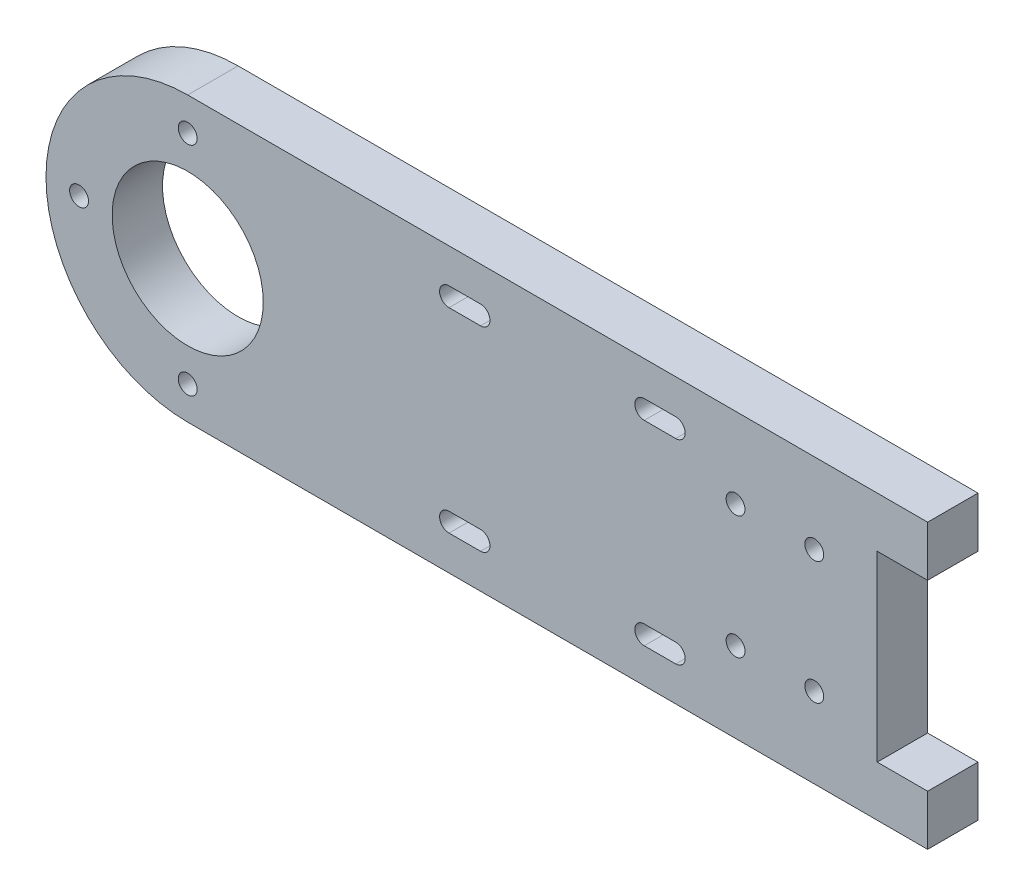
ISO-10303-21;
HEADER;
FILE_DESCRIPTION(('STEP AP214'),'2;1');
FILE_NAME('part.step','',(''),(''),'','','');
FILE_SCHEMA(('AUTOMOTIVE_DESIGN { 1 0 10303 214 1 1 1 1 }'));
ENDSEC;
DATA;
#1=APPLICATION_CONTEXT('core data for automotive mechanical design processes');
#2=APPLICATION_PROTOCOL_DEFINITION('international standard','automotive_design',2000,#1);
#3=PRODUCT_CONTEXT('',#1,'mechanical');
#4=PRODUCT('Part','Part','',(#3));
#5=PRODUCT_RELATED_PRODUCT_CATEGORY('part','',(#4));
#6=PRODUCT_DEFINITION_FORMATION('','',#4);
#7=PRODUCT_DEFINITION_CONTEXT('part definition',#1,'design');
#8=PRODUCT_DEFINITION('design','',#6,#7);
#9=PRODUCT_DEFINITION_SHAPE('','',#8);
#10=(LENGTH_UNIT() NAMED_UNIT(*) SI_UNIT(.MILLI.,.METRE.));
#11=(NAMED_UNIT(*) PLANE_ANGLE_UNIT() SI_UNIT($,.RADIAN.));
#12=(NAMED_UNIT(*) SI_UNIT($,.STERADIAN.) SOLID_ANGLE_UNIT());
#13=UNCERTAINTY_MEASURE_WITH_UNIT(LENGTH_MEASURE(1.E-05),#10,'distance_accuracy_value','');
#14=(GEOMETRIC_REPRESENTATION_CONTEXT(3) GLOBAL_UNCERTAINTY_ASSIGNED_CONTEXT((#13)) GLOBAL_UNIT_ASSIGNED_CONTEXT((#10,
#11,#12)) REPRESENTATION_CONTEXT('',''));
#15=CARTESIAN_POINT('',(0.,0.,0.));
#16=DIRECTION('',(0.,0.,1.));
#17=DIRECTION('',(1.,0.,0.));
#18=AXIS2_PLACEMENT_3D('',#15,#16,#17);
#19=CARTESIAN_POINT('',(0.,8.,8.));
#20=DIRECTION('',(0.,-1.,0.));
#21=DIRECTION('',(0.,0.,-1.));
#22=AXIS2_PLACEMENT_3D('',#19,#20,#21);
#23=PLANE('',#22);
#24=DIRECTION('',(-1.,0.,0.));
#25=VECTOR('',#24,1.);
#26=CARTESIAN_POINT('',(0.,8.,0.));
#27=LINE('',#26,#25);
#28=CARTESIAN_POINT('',(0.,8.,0.));
#29=VERTEX_POINT('',#28);
#30=CARTESIAN_POINT('',(-8.,8.,0.));
#31=VERTEX_POINT('',#30);
#32=EDGE_CURVE('E321',#29,#31,#27,.T.);
#33=ORIENTED_EDGE('',*,*,#32,.T.);
#34=DIRECTION('',(0.,0.,-1.));
#35=VECTOR('',#34,1.);
#36=CARTESIAN_POINT('',(-8.,8.,8.));
#37=LINE('',#36,#35);
#38=CARTESIAN_POINT('',(-8.,8.,8.));
#39=VERTEX_POINT('',#38);
#40=EDGE_CURVE('E373',#39,#31,#37,.T.);
#41=ORIENTED_EDGE('',*,*,#40,.F.);
#42=DIRECTION('',(-1.,0.,0.));
#43=VECTOR('',#42,1.);
#44=CARTESIAN_POINT('',(0.,8.,8.));
#45=LINE('',#44,#43);
#46=CARTESIAN_POINT('',(0.,8.,8.));
#47=VERTEX_POINT('',#46);
#48=EDGE_CURVE('E325',#47,#39,#45,.T.);
#49=ORIENTED_EDGE('',*,*,#48,.F.);
#50=DIRECTION('',(0.,0.,-1.));
#51=VECTOR('',#50,1.);
#52=CARTESIAN_POINT('',(0.,8.,8.));
#53=LINE('',#52,#51);
#54=EDGE_CURVE('E344',#47,#29,#53,.T.);
#55=ORIENTED_EDGE('',*,*,#54,.T.);
#56=EDGE_LOOP('',(#33,#41,#49,#55));
#57=FACE_BOUND('',#56,.T.);
#58=ADVANCED_FACE('F36',(#57),#23,.F.);
#59=CARTESIAN_POINT('',(-8.,0.,8.));
#60=DIRECTION('',(-1.,0.,0.));
#61=DIRECTION('',(0.,0.,1.));
#62=AXIS2_PLACEMENT_3D('',#59,#60,#61);
#63=PLANE('',#62);
#64=DIRECTION('',(0.,1.,0.));
#65=VECTOR('',#64,1.);
#66=CARTESIAN_POINT('',(-8.,0.,0.));
#67=LINE('',#66,#65);
#68=CARTESIAN_POINT('',(-8.,37.,0.));
#69=VERTEX_POINT('',#68);
#70=EDGE_CURVE('E347',#31,#69,#67,.T.);
#71=ORIENTED_EDGE('',*,*,#70,.T.);
#72=DIRECTION('',(0.,0.,-1.));
#73=VECTOR('',#72,1.);
#74=CARTESIAN_POINT('',(-8.,37.,8.));
#75=LINE('',#74,#73);
#76=CARTESIAN_POINT('',(-8.,37.,8.));
#77=VERTEX_POINT('',#76);
#78=EDGE_CURVE('E371',#77,#69,#75,.T.);
#79=ORIENTED_EDGE('',*,*,#78,.F.);
#80=DIRECTION('',(0.,1.,0.));
#81=VECTOR('',#80,1.);
#82=CARTESIAN_POINT('',(-8.,0.,8.));
#83=LINE('',#82,#81);
#84=EDGE_CURVE('E328',#39,#77,#83,.T.);
#85=ORIENTED_EDGE('',*,*,#84,.F.);
#86=ORIENTED_EDGE('',*,*,#40,.T.);
#87=EDGE_LOOP('',(#71,#79,#85,#86));
#88=FACE_BOUND('',#87,.T.);
#89=ADVANCED_FACE('F461',(#88),#63,.F.);
#90=CARTESIAN_POINT('',(0.,37.,8.));
#91=DIRECTION('',(0.,-1.,0.));
#92=DIRECTION('',(0.,0.,-1.));
#93=AXIS2_PLACEMENT_3D('',#90,#91,#92);
#94=PLANE('',#93);
#95=DIRECTION('',(-1.,0.,0.));
#96=VECTOR('',#95,1.);
#97=CARTESIAN_POINT('',(0.,37.,0.));
#98=LINE('',#97,#96);
#99=CARTESIAN_POINT('',(0.,37.,0.));
#100=VERTEX_POINT('',#99);
#101=EDGE_CURVE('E350',#100,#69,#98,.T.);
#102=ORIENTED_EDGE('',*,*,#101,.F.);
#103=DIRECTION('',(0.,0.,-1.));
#104=VECTOR('',#103,1.);
#105=CARTESIAN_POINT('',(0.,37.,8.));
#106=LINE('',#105,#104);
#107=CARTESIAN_POINT('',(0.,37.,8.));
#108=VERTEX_POINT('',#107);
#109=EDGE_CURVE('E369',#108,#100,#106,.T.);
#110=ORIENTED_EDGE('',*,*,#109,.F.);
#111=DIRECTION('',(-1.,0.,0.));
#112=VECTOR('',#111,1.);
#113=CARTESIAN_POINT('',(0.,37.,8.));
#114=LINE('',#113,#112);
#115=EDGE_CURVE('E331',#108,#77,#114,.T.);
#116=ORIENTED_EDGE('',*,*,#115,.T.);
#117=ORIENTED_EDGE('',*,*,#78,.T.);
#118=EDGE_LOOP('',(#102,#110,#116,#117));
#119=FACE_BOUND('',#118,.T.);
#120=ADVANCED_FACE('F467',(#119),#94,.T.);
#121=CARTESIAN_POINT('',(0.,0.,8.));
#122=DIRECTION('',(-1.,0.,0.));
#123=DIRECTION('',(0.,0.,1.));
#124=AXIS2_PLACEMENT_3D('',#121,#122,#123);
#125=PLANE('',#124);
#126=DIRECTION('',(0.,1.,0.));
#127=VECTOR('',#126,1.);
#128=CARTESIAN_POINT('',(0.,0.,0.));
#129=LINE('',#128,#127);
#130=CARTESIAN_POINT('',(0.,45.,0.));
#131=VERTEX_POINT('',#130);
#132=EDGE_CURVE('E353',#100,#131,#129,.T.);
#133=ORIENTED_EDGE('',*,*,#132,.T.);
#134=DIRECTION('',(0.,0.,-1.));
#135=VECTOR('',#134,1.);
#136=CARTESIAN_POINT('',(0.,45.,8.));
#137=LINE('',#136,#135);
#138=CARTESIAN_POINT('',(0.,45.,8.));
#139=VERTEX_POINT('',#138);
#140=EDGE_CURVE('E366',#139,#131,#137,.T.);
#141=ORIENTED_EDGE('',*,*,#140,.F.);
#142=DIRECTION('',(0.,1.,0.));
#143=VECTOR('',#142,1.);
#144=CARTESIAN_POINT('',(0.,0.,8.));
#145=LINE('',#144,#143);
#146=EDGE_CURVE('E334',#108,#139,#145,.T.);
#147=ORIENTED_EDGE('',*,*,#146,.F.);
#148=ORIENTED_EDGE('',*,*,#109,.T.);
#149=EDGE_LOOP('',(#133,#141,#147,#148));
#150=FACE_BOUND('',#149,.T.);
#151=ADVANCED_FACE('F497',(#150),#125,.F.);
#152=CARTESIAN_POINT('',(0.,45.,8.));
#153=DIRECTION('',(0.,-1.,0.));
#154=DIRECTION('',(1.,0.,0.));
#155=AXIS2_PLACEMENT_3D('',#152,#153,#154);
#156=PLANE('',#155);
#157=DIRECTION('',(-1.,0.,0.));
#158=VECTOR('',#157,1.);
#159=CARTESIAN_POINT('',(0.,45.,0.));
#160=LINE('',#159,#158);
#161=CARTESIAN_POINT('',(-117.5,45.,0.));
#162=VERTEX_POINT('',#161);
#163=EDGE_CURVE('E355',#131,#162,#160,.T.);
#164=ORIENTED_EDGE('',*,*,#163,.T.);
#165=DIRECTION('',(0.,0.,-1.));
#166=VECTOR('',#165,1.);
#167=CARTESIAN_POINT('',(-117.5,45.,8.));
#168=LINE('',#167,#166);
#169=CARTESIAN_POINT('',(-117.5,45.,8.));
#170=VERTEX_POINT('',#169);
#171=EDGE_CURVE('E380',#162,#170,#168,.F.);
#172=ORIENTED_EDGE('',*,*,#171,.T.);
#173=DIRECTION('',(-1.,0.,0.));
#174=VECTOR('',#173,1.);
#175=CARTESIAN_POINT('',(0.,45.,8.));
#176=LINE('',#175,#174);
#177=EDGE_CURVE('E336',#139,#170,#176,.T.);
#178=ORIENTED_EDGE('',*,*,#177,.F.);
#179=ORIENTED_EDGE('',*,*,#140,.T.);
#180=EDGE_LOOP('',(#164,#172,#178,#179));
#181=FACE_BOUND('',#180,.T.);
#182=ADVANCED_FACE('F491',(#181),#156,.F.);
#183=CARTESIAN_POINT('',(0.,0.,8.));
#184=DIRECTION('',(0.,-1.,0.));
#185=DIRECTION('',(1.,0.,0.));
#186=AXIS2_PLACEMENT_3D('',#183,#184,#185);
#187=PLANE('',#186);
#188=DIRECTION('',(-1.,0.,0.));
#189=VECTOR('',#188,1.);
#190=CARTESIAN_POINT('',(0.,0.,8.));
#191=LINE('',#190,#189);
#192=CARTESIAN_POINT('',(0.,0.,8.));
#193=VERTEX_POINT('',#192);
#194=CARTESIAN_POINT('',(-117.5,0.,8.));
#195=VERTEX_POINT('',#194);
#196=EDGE_CURVE('E339',#193,#195,#191,.T.);
#197=ORIENTED_EDGE('',*,*,#196,.T.);
#198=DIRECTION('',(0.,0.,-1.));
#199=VECTOR('',#198,1.);
#200=CARTESIAN_POINT('',(-117.5,0.,8.));
#201=LINE('',#200,#199);
#202=CARTESIAN_POINT('',(-117.5,0.,0.));
#203=VERTEX_POINT('',#202);
#204=EDGE_CURVE('E387',#195,#203,#201,.T.);
#205=ORIENTED_EDGE('',*,*,#204,.T.);
#206=DIRECTION('',(-1.,0.,0.));
#207=VECTOR('',#206,1.);
#208=CARTESIAN_POINT('',(0.,0.,0.));
#209=LINE('',#208,#207);
#210=CARTESIAN_POINT('',(0.,0.,0.));
#211=VERTEX_POINT('',#210);
#212=EDGE_CURVE('E358',#211,#203,#209,.T.);
#213=ORIENTED_EDGE('',*,*,#212,.F.);
#214=DIRECTION('',(0.,0.,-1.));
#215=VECTOR('',#214,1.);
#216=CARTESIAN_POINT('',(0.,0.,8.));
#217=LINE('',#216,#215);
#218=EDGE_CURVE('E364',#193,#211,#217,.T.);
#219=ORIENTED_EDGE('',*,*,#218,.F.);
#220=EDGE_LOOP('',(#197,#205,#213,#219));
#221=FACE_BOUND('',#220,.T.);
#222=ADVANCED_FACE('F507',(#221),#187,.T.);
#223=CARTESIAN_POINT('',(0.,0.,8.));
#224=DIRECTION('',(-1.,0.,0.));
#225=DIRECTION('',(0.,0.,1.));
#226=AXIS2_PLACEMENT_3D('',#223,#224,#225);
#227=PLANE('',#226);
#228=DIRECTION('',(0.,1.,0.));
#229=VECTOR('',#228,1.);
#230=CARTESIAN_POINT('',(0.,0.,0.));
#231=LINE('',#230,#229);
#232=EDGE_CURVE('E329',#211,#29,#231,.T.);
#233=ORIENTED_EDGE('',*,*,#232,.T.);
#234=ORIENTED_EDGE('',*,*,#54,.F.);
#235=DIRECTION('',(0.,1.,0.));
#236=VECTOR('',#235,1.);
#237=CARTESIAN_POINT('',(0.,0.,8.));
#238=LINE('',#237,#236);
#239=EDGE_CURVE('E342',#193,#47,#238,.T.);
#240=ORIENTED_EDGE('',*,*,#239,.F.);
#241=ORIENTED_EDGE('',*,*,#218,.T.);
#242=EDGE_LOOP('',(#233,#234,#240,#241));
#243=FACE_BOUND('',#242,.T.);
#244=ADVANCED_FACE('F511',(#243),#227,.F.);
#245=CARTESIAN_POINT('',(0.,0.,8.));
#246=DIRECTION('',(0.,0.,1.));
#247=DIRECTION('',(1.,0.,0.));
#248=AXIS2_PLACEMENT_3D('',#245,#246,#247);
#249=PLANE('',#248);
#250=CARTESIAN_POINT('',(-117.5,5.24999999999999,8.));
#251=DIRECTION('',(0.,0.,1.));
#252=DIRECTION('',(1.,0.,0.));
#253=AXIS2_PLACEMENT_3D('',#250,#251,#252);
#254=CIRCLE('',#253,1.5);
#255=CARTESIAN_POINT('',(-116.,5.24999999999999,8.));
#256=VERTEX_POINT('',#255);
#257=EDGE_CURVE('E695',#256,#256,#254,.T.);
#258=ORIENTED_EDGE('',*,*,#257,.F.);
#259=EDGE_LOOP('',(#258));
#260=FACE_BOUND('',#259,.T.);
#261=CARTESIAN_POINT('',(-134.75,22.5,8.));
#262=DIRECTION('',(0.,0.,1.));
#263=DIRECTION('',(1.,0.,0.));
#264=AXIS2_PLACEMENT_3D('',#261,#262,#263);
#265=CIRCLE('',#264,1.5);
#266=CARTESIAN_POINT('',(-133.25,22.5,8.));
#267=VERTEX_POINT('',#266);
#268=EDGE_CURVE('E696',#267,#267,#265,.T.);
#269=ORIENTED_EDGE('',*,*,#268,.F.);
#270=EDGE_LOOP('',(#269));
#271=FACE_BOUND('',#270,.T.);
#272=CARTESIAN_POINT('',(-117.5,39.75,8.));
#273=DIRECTION('',(0.,0.,1.));
#274=DIRECTION('',(1.,0.,0.));
#275=AXIS2_PLACEMENT_3D('',#272,#273,#274);
#276=CIRCLE('',#275,1.5);
#277=CARTESIAN_POINT('',(-116.,39.75,8.));
#278=VERTEX_POINT('',#277);
#279=EDGE_CURVE('E705',#278,#278,#276,.T.);
#280=ORIENTED_EDGE('',*,*,#279,.F.);
#281=EDGE_LOOP('',(#280));
#282=FACE_BOUND('',#281,.T.);
#283=DIRECTION('',(1.,0.,0.));
#284=VECTOR('',#283,1.);
#285=CARTESIAN_POINT('',(0.,5.49999999999997,8.));
#286=LINE('',#285,#284);
#287=CARTESIAN_POINT('',(-75.9999999999992,5.49999999999997,8.));
#288=VERTEX_POINT('',#287);
#289=CARTESIAN_POINT('',(-70.9999999999992,5.49999999999997,8.));
#290=VERTEX_POINT('',#289);
#291=EDGE_CURVE('E51',#288,#290,#286,.T.);
#292=ORIENTED_EDGE('',*,*,#291,.F.);
#293=CARTESIAN_POINT('',(-75.9999999999992,6.99999999999997,8.));
#294=DIRECTION('',(0.,0.,1.));
#295=DIRECTION('',(1.,0.,0.));
#296=AXIS2_PLACEMENT_3D('',#293,#294,#295);
#297=CIRCLE('',#296,1.5);
#298=CARTESIAN_POINT('',(-75.9999999999992,8.49999999999997,8.));
#299=VERTEX_POINT('',#298);
#300=EDGE_CURVE('E242',#299,#288,#297,.T.);
#301=ORIENTED_EDGE('',*,*,#300,.F.);
#302=DIRECTION('',(1.,0.,0.));
#303=VECTOR('',#302,1.);
#304=CARTESIAN_POINT('',(0.,8.49999999999997,8.));
#305=LINE('',#304,#303);
#306=CARTESIAN_POINT('',(-70.9999999999992,8.49999999999997,8.));
#307=VERTEX_POINT('',#306);
#308=EDGE_CURVE('E251',#299,#307,#305,.T.);
#309=ORIENTED_EDGE('',*,*,#308,.T.);
#310=CARTESIAN_POINT('',(-70.9999999999992,6.99999999999997,8.));
#311=DIRECTION('',(0.,0.,1.));
#312=DIRECTION('',(1.,0.,0.));
#313=AXIS2_PLACEMENT_3D('',#310,#311,#312);
#314=CIRCLE('',#313,1.5);
#315=EDGE_CURVE('E254',#290,#307,#314,.T.);
#316=ORIENTED_EDGE('',*,*,#315,.F.);
#317=EDGE_LOOP('',(#292,#301,#309,#316));
#318=FACE_BOUND('',#317,.T.);
#319=CARTESIAN_POINT('',(-45.,38.,8.));
#320=DIRECTION('',(0.,0.,1.));
#321=DIRECTION('',(1.,0.,0.));
#322=AXIS2_PLACEMENT_3D('',#319,#320,#321);
#323=CIRCLE('',#322,1.50000000000001);
#324=CARTESIAN_POINT('',(-45.,39.5,8.));
#325=VERTEX_POINT('',#324);
#326=CARTESIAN_POINT('',(-45.,36.5,8.));
#327=VERTEX_POINT('',#326);
#328=EDGE_CURVE('E59',#325,#327,#323,.T.);
#329=ORIENTED_EDGE('',*,*,#328,.F.);
#330=DIRECTION('',(1.,0.,0.));
#331=VECTOR('',#330,1.);
#332=CARTESIAN_POINT('',(-45.,39.5,8.));
#333=LINE('',#332,#331);
#334=CARTESIAN_POINT('',(-40.,39.5,8.));
#335=VERTEX_POINT('',#334);
#336=EDGE_CURVE('E261',#325,#335,#333,.T.);
#337=ORIENTED_EDGE('',*,*,#336,.T.);
#338=CARTESIAN_POINT('',(-40.,38.,8.));
#339=DIRECTION('',(0.,0.,1.));
#340=DIRECTION('',(1.,0.,0.));
#341=AXIS2_PLACEMENT_3D('',#338,#339,#340);
#342=CIRCLE('',#341,1.50000000000001);
#343=CARTESIAN_POINT('',(-40.,36.5,8.));
#344=VERTEX_POINT('',#343);
#345=EDGE_CURVE('E267',#344,#335,#342,.T.);
#346=ORIENTED_EDGE('',*,*,#345,.F.);
#347=DIRECTION('',(1.,0.,0.));
#348=VECTOR('',#347,1.);
#349=CARTESIAN_POINT('',(-45.,36.5,8.));
#350=LINE('',#349,#348);
#351=EDGE_CURVE('E270',#327,#344,#350,.T.);
#352=ORIENTED_EDGE('',*,*,#351,.F.);
#353=EDGE_LOOP('',(#329,#337,#346,#352));
#354=FACE_BOUND('',#353,.T.);
#355=CARTESIAN_POINT('',(-44.9999999999992,6.99999999999997,8.));
#356=DIRECTION('',(0.,0.,1.));
#357=DIRECTION('',(1.,0.,0.));
#358=AXIS2_PLACEMENT_3D('',#355,#356,#357);
#359=CIRCLE('',#358,1.5);
#360=CARTESIAN_POINT('',(-44.9999999999992,8.49999999999997,8.));
#361=VERTEX_POINT('',#360);
#362=CARTESIAN_POINT('',(-44.9999999999992,5.49999999999997,8.));
#363=VERTEX_POINT('',#362);
#364=EDGE_CURVE('E209',#361,#363,#359,.T.);
#365=ORIENTED_EDGE('',*,*,#364,.F.);
#366=DIRECTION('',(1.,0.,0.));
#367=VECTOR('',#366,1.);
#368=CARTESIAN_POINT('',(-44.9999999999992,8.49999999999997,8.));
#369=LINE('',#368,#367);
#370=CARTESIAN_POINT('',(-39.9999999999992,8.49999999999997,8.));
#371=VERTEX_POINT('',#370);
#372=EDGE_CURVE('E219',#361,#371,#369,.T.);
#373=ORIENTED_EDGE('',*,*,#372,.T.);
#374=CARTESIAN_POINT('',(-39.9999999999992,6.99999999999997,8.));
#375=DIRECTION('',(0.,0.,1.));
#376=DIRECTION('',(1.,0.,0.));
#377=AXIS2_PLACEMENT_3D('',#374,#375,#376);
#378=CIRCLE('',#377,1.5);
#379=CARTESIAN_POINT('',(-39.9999999999992,5.49999999999997,8.));
#380=VERTEX_POINT('',#379);
#381=EDGE_CURVE('E225',#380,#371,#378,.T.);
#382=ORIENTED_EDGE('',*,*,#381,.F.);
#383=DIRECTION('',(1.,0.,0.));
#384=VECTOR('',#383,1.);
#385=CARTESIAN_POINT('',(-44.9999999999992,5.49999999999997,8.));
#386=LINE('',#385,#384);
#387=EDGE_CURVE('E232',#363,#380,#386,.T.);
#388=ORIENTED_EDGE('',*,*,#387,.F.);
#389=EDGE_LOOP('',(#365,#373,#382,#388));
#390=FACE_BOUND('',#389,.T.);
#391=DIRECTION('',(1.,0.,0.));
#392=VECTOR('',#391,1.);
#393=CARTESIAN_POINT('',(0.,36.5,8.));
#394=LINE('',#393,#392);
#395=CARTESIAN_POINT('',(-76.,36.5,8.));
#396=VERTEX_POINT('',#395);
#397=CARTESIAN_POINT('',(-71.,36.5,8.));
#398=VERTEX_POINT('',#397);
#399=EDGE_CURVE('E258',#396,#398,#394,.T.);
#400=ORIENTED_EDGE('',*,*,#399,.F.);
#401=CARTESIAN_POINT('',(-76.,38.,8.));
#402=DIRECTION('',(0.,0.,1.));
#403=DIRECTION('',(1.,0.,0.));
#404=AXIS2_PLACEMENT_3D('',#401,#402,#403);
#405=CIRCLE('',#404,1.50000000000001);
#406=CARTESIAN_POINT('',(-76.,39.5,8.));
#407=VERTEX_POINT('',#406);
#408=EDGE_CURVE('E281',#407,#396,#405,.T.);
#409=ORIENTED_EDGE('',*,*,#408,.F.);
#410=DIRECTION('',(1.,0.,0.));
#411=VECTOR('',#410,1.);
#412=CARTESIAN_POINT('',(0.,39.5,8.));
#413=LINE('',#412,#411);
#414=CARTESIAN_POINT('',(-71.,39.5,8.));
#415=VERTEX_POINT('',#414);
#416=EDGE_CURVE('E278',#407,#415,#413,.T.);
#417=ORIENTED_EDGE('',*,*,#416,.T.);
#418=CARTESIAN_POINT('',(-71.,38.,8.));
#419=DIRECTION('',(0.,0.,1.));
#420=DIRECTION('',(1.,0.,0.));
#421=AXIS2_PLACEMENT_3D('',#418,#419,#420);
#422=CIRCLE('',#421,1.50000000000001);
#423=EDGE_CURVE('E275',#398,#415,#422,.T.);
#424=ORIENTED_EDGE('',*,*,#423,.F.);
#425=EDGE_LOOP('',(#400,#409,#417,#424));
#426=FACE_BOUND('',#425,.T.);
#427=CARTESIAN_POINT('',(-18.,12.75,8.));
#428=DIRECTION('',(0.,0.,1.));
#429=DIRECTION('',(1.,0.,0.));
#430=AXIS2_PLACEMENT_3D('',#427,#428,#429);
#431=CIRCLE('',#430,1.5);
#432=CARTESIAN_POINT('',(-16.5,12.75,8.));
#433=VERTEX_POINT('',#432);
#434=EDGE_CURVE('E307',#433,#433,#431,.T.);
#435=ORIENTED_EDGE('',*,*,#434,.F.);
#436=EDGE_LOOP('',(#435));
#437=FACE_BOUND('',#436,.T.);
#438=CARTESIAN_POINT('',(-18.,32.25,8.));
#439=DIRECTION('',(0.,0.,1.));
#440=DIRECTION('',(1.,0.,0.));
#441=AXIS2_PLACEMENT_3D('',#438,#439,#440);
#442=CIRCLE('',#441,1.5);
#443=CARTESIAN_POINT('',(-16.5,32.25,8.));
#444=VERTEX_POINT('',#443);
#445=EDGE_CURVE('E301',#444,#444,#442,.T.);
#446=ORIENTED_EDGE('',*,*,#445,.F.);
#447=EDGE_LOOP('',(#446));
#448=FACE_BOUND('',#447,.T.);
#449=CARTESIAN_POINT('',(-30.5,32.2499999999999,8.));
#450=DIRECTION('',(0.,0.,1.));
#451=DIRECTION('',(1.,0.,0.));
#452=AXIS2_PLACEMENT_3D('',#449,#450,#451);
#453=CIRCLE('',#452,1.5);
#454=CARTESIAN_POINT('',(-29.,32.2499999999999,8.));
#455=VERTEX_POINT('',#454);
#456=EDGE_CURVE('E294',#455,#455,#453,.T.);
#457=ORIENTED_EDGE('',*,*,#456,.F.);
#458=EDGE_LOOP('',(#457));
#459=FACE_BOUND('',#458,.T.);
#460=CARTESIAN_POINT('',(-30.4999999999998,12.7499999999999,8.));
#461=DIRECTION('',(0.,0.,1.));
#462=DIRECTION('',(1.,0.,0.));
#463=AXIS2_PLACEMENT_3D('',#460,#461,#462);
#464=CIRCLE('',#463,1.5);
#465=CARTESIAN_POINT('',(-28.9999999999998,12.7499999999999,8.));
#466=VERTEX_POINT('',#465);
#467=EDGE_CURVE('E297',#466,#466,#464,.T.);
#468=ORIENTED_EDGE('',*,*,#467,.F.);
#469=EDGE_LOOP('',(#468));
#470=FACE_BOUND('',#469,.T.);
#471=CARTESIAN_POINT('',(-117.5,22.5,8.));
#472=DIRECTION('',(0.,0.,1.));
#473=DIRECTION('',(1.,0.,0.));
#474=AXIS2_PLACEMENT_3D('',#471,#472,#473);
#475=CIRCLE('',#474,12.);
#476=CARTESIAN_POINT('',(-105.5,22.5,8.));
#477=VERTEX_POINT('',#476);
#478=EDGE_CURVE('E322',#477,#477,#475,.T.);
#479=ORIENTED_EDGE('',*,*,#478,.F.);
#480=EDGE_LOOP('',(#479));
#481=FACE_BOUND('',#480,.T.);
#482=ORIENTED_EDGE('',*,*,#177,.T.);
#483=CARTESIAN_POINT('',(-117.5,22.5,8.));
#484=DIRECTION('',(0.,0.,1.));
#485=DIRECTION('',(1.,0.,0.));
#486=AXIS2_PLACEMENT_3D('',#483,#484,#485);
#487=CIRCLE('',#486,22.5);
#488=CARTESIAN_POINT('',(-140.,22.5,8.));
#489=VERTEX_POINT('',#488);
#490=EDGE_CURVE('E385',#170,#489,#487,.T.);
#491=ORIENTED_EDGE('',*,*,#490,.T.);
#492=CARTESIAN_POINT('',(-117.5,22.5,8.));
#493=DIRECTION('',(0.,0.,1.));
#494=DIRECTION('',(1.,0.,0.));
#495=AXIS2_PLACEMENT_3D('',#492,#493,#494);
#496=CIRCLE('',#495,22.5);
#497=EDGE_CURVE('E383',#489,#195,#496,.T.);
#498=ORIENTED_EDGE('',*,*,#497,.T.);
#499=ORIENTED_EDGE('',*,*,#196,.F.);
#500=ORIENTED_EDGE('',*,*,#239,.T.);
#501=ORIENTED_EDGE('',*,*,#48,.T.);
#502=ORIENTED_EDGE('',*,*,#84,.T.);
#503=ORIENTED_EDGE('',*,*,#115,.F.);
#504=ORIENTED_EDGE('',*,*,#146,.T.);
#505=EDGE_LOOP('',(#482,#491,#498,#499,#500,#501,#502,#503,#504));
#506=FACE_BOUND('',#505,.T.);
#507=ADVANCED_FACE('F229',(#260,#271,#282,#318,#354,#390,#426,#437,#448,#459,#470,#481,#506),
#249,.T.);
#508=CARTESIAN_POINT('',(0.,0.,0.));
#509=DIRECTION('',(0.,0.,1.));
#510=DIRECTION('',(1.,0.,0.));
#511=AXIS2_PLACEMENT_3D('',#508,#509,#510);
#512=PLANE('',#511);
#513=CARTESIAN_POINT('',(-117.5,5.24999999999999,0.));
#514=DIRECTION('',(0.,0.,1.));
#515=DIRECTION('',(1.,0.,0.));
#516=AXIS2_PLACEMENT_3D('',#513,#514,#515);
#517=CIRCLE('',#516,1.5);
#518=CARTESIAN_POINT('',(-116.,5.24999999999999,0.));
#519=VERTEX_POINT('',#518);
#520=EDGE_CURVE('E216',#519,#519,#517,.T.);
#521=ORIENTED_EDGE('',*,*,#520,.T.);
#522=EDGE_LOOP('',(#521));
#523=FACE_BOUND('',#522,.T.);
#524=CARTESIAN_POINT('',(-134.75,22.5,0.));
#525=DIRECTION('',(0.,0.,1.));
#526=DIRECTION('',(1.,0.,0.));
#527=AXIS2_PLACEMENT_3D('',#524,#525,#526);
#528=CIRCLE('',#527,1.5);
#529=CARTESIAN_POINT('',(-133.25,22.5,0.));
#530=VERTEX_POINT('',#529);
#531=EDGE_CURVE('E700',#530,#530,#528,.T.);
#532=ORIENTED_EDGE('',*,*,#531,.T.);
#533=EDGE_LOOP('',(#532));
#534=FACE_BOUND('',#533,.T.);
#535=CARTESIAN_POINT('',(-117.5,39.75,0.));
#536=DIRECTION('',(0.,0.,1.));
#537=DIRECTION('',(1.,0.,0.));
#538=AXIS2_PLACEMENT_3D('',#535,#536,#537);
#539=CIRCLE('',#538,1.5);
#540=CARTESIAN_POINT('',(-116.,39.75,0.));
#541=VERTEX_POINT('',#540);
#542=EDGE_CURVE('E708',#541,#541,#539,.T.);
#543=ORIENTED_EDGE('',*,*,#542,.T.);
#544=EDGE_LOOP('',(#543));
#545=FACE_BOUND('',#544,.T.);
#546=CARTESIAN_POINT('',(-75.9999999999992,6.99999999999997,0.));
#547=DIRECTION('',(0.,0.,1.));
#548=DIRECTION('',(1.,0.,0.));
#549=AXIS2_PLACEMENT_3D('',#546,#547,#548);
#550=CIRCLE('',#549,1.5);
#551=CARTESIAN_POINT('',(-75.9999999999992,8.49999999999997,0.));
#552=VERTEX_POINT('',#551);
#553=CARTESIAN_POINT('',(-75.9999999999992,5.49999999999997,0.));
#554=VERTEX_POINT('',#553);
#555=EDGE_CURVE('E44',#552,#554,#550,.T.);
#556=ORIENTED_EDGE('',*,*,#555,.T.);
#557=DIRECTION('',(1.,0.,0.));
#558=VECTOR('',#557,1.);
#559=CARTESIAN_POINT('',(0.,5.49999999999997,0.));
#560=LINE('',#559,#558);
#561=CARTESIAN_POINT('',(-70.9999999999992,5.49999999999997,0.));
#562=VERTEX_POINT('',#561);
#563=EDGE_CURVE('E11',#554,#562,#560,.T.);
#564=ORIENTED_EDGE('',*,*,#563,.T.);
#565=CARTESIAN_POINT('',(-70.9999999999992,6.99999999999997,0.));
#566=DIRECTION('',(0.,0.,1.));
#567=DIRECTION('',(1.,0.,0.));
#568=AXIS2_PLACEMENT_3D('',#565,#566,#567);
#569=CIRCLE('',#568,1.5);
#570=CARTESIAN_POINT('',(-70.9999999999992,8.49999999999997,0.));
#571=VERTEX_POINT('',#570);
#572=EDGE_CURVE('E423',#562,#571,#569,.T.);
#573=ORIENTED_EDGE('',*,*,#572,.T.);
#574=DIRECTION('',(1.,0.,0.));
#575=VECTOR('',#574,1.);
#576=CARTESIAN_POINT('',(0.,8.49999999999997,0.));
#577=LINE('',#576,#575);
#578=EDGE_CURVE('E426',#552,#571,#577,.T.);
#579=ORIENTED_EDGE('',*,*,#578,.F.);
#580=EDGE_LOOP('',(#556,#564,#573,#579));
#581=FACE_BOUND('',#580,.T.);
#582=DIRECTION('',(1.,0.,0.));
#583=VECTOR('',#582,1.);
#584=CARTESIAN_POINT('',(0.,39.5,0.));
#585=LINE('',#584,#583);
#586=CARTESIAN_POINT('',(-45.,39.5,0.));
#587=VERTEX_POINT('',#586);
#588=CARTESIAN_POINT('',(-40.,39.5,0.));
#589=VERTEX_POINT('',#588);
#590=EDGE_CURVE('E418',#587,#589,#585,.T.);
#591=ORIENTED_EDGE('',*,*,#590,.F.);
#592=CARTESIAN_POINT('',(-45.,38.,0.));
#593=DIRECTION('',(0.,0.,1.));
#594=DIRECTION('',(1.,0.,0.));
#595=AXIS2_PLACEMENT_3D('',#592,#593,#594);
#596=CIRCLE('',#595,1.50000000000001);
#597=CARTESIAN_POINT('',(-45.,36.5,0.));
#598=VERTEX_POINT('',#597);
#599=EDGE_CURVE('E420',#587,#598,#596,.T.);
#600=ORIENTED_EDGE('',*,*,#599,.T.);
#601=DIRECTION('',(1.,0.,0.));
#602=VECTOR('',#601,1.);
#603=CARTESIAN_POINT('',(0.,36.5,0.));
#604=LINE('',#603,#602);
#605=CARTESIAN_POINT('',(-40.,36.5,0.));
#606=VERTEX_POINT('',#605);
#607=EDGE_CURVE('E412',#598,#606,#604,.T.);
#608=ORIENTED_EDGE('',*,*,#607,.T.);
#609=CARTESIAN_POINT('',(-40.,38.,0.));
#610=DIRECTION('',(0.,0.,1.));
#611=DIRECTION('',(1.,0.,0.));
#612=AXIS2_PLACEMENT_3D('',#609,#610,#611);
#613=CIRCLE('',#612,1.50000000000001);
#614=EDGE_CURVE('E415',#606,#589,#613,.T.);
#615=ORIENTED_EDGE('',*,*,#614,.T.);
#616=EDGE_LOOP('',(#591,#600,#608,#615));
#617=FACE_BOUND('',#616,.T.);
#618=DIRECTION('',(1.,0.,0.));
#619=VECTOR('',#618,1.);
#620=CARTESIAN_POINT('',(0.,8.49999999999997,0.));
#621=LINE('',#620,#619);
#622=CARTESIAN_POINT('',(-44.9999999999992,8.49999999999997,0.));
#623=VERTEX_POINT('',#622);
#624=CARTESIAN_POINT('',(-39.9999999999992,8.49999999999997,0.));
#625=VERTEX_POINT('',#624);
#626=EDGE_CURVE('E409',#623,#625,#621,.T.);
#627=ORIENTED_EDGE('',*,*,#626,.F.);
#628=CARTESIAN_POINT('',(-44.9999999999992,6.99999999999997,0.));
#629=DIRECTION('',(0.,0.,1.));
#630=DIRECTION('',(1.,0.,0.));
#631=AXIS2_PLACEMENT_3D('',#628,#629,#630);
#632=CIRCLE('',#631,1.5);
#633=CARTESIAN_POINT('',(-44.9999999999992,5.49999999999997,0.));
#634=VERTEX_POINT('',#633);
#635=EDGE_CURVE('E212',#623,#634,#632,.T.);
#636=ORIENTED_EDGE('',*,*,#635,.T.);
#637=DIRECTION('',(1.,0.,0.));
#638=VECTOR('',#637,1.);
#639=CARTESIAN_POINT('',(0.,5.49999999999997,0.));
#640=LINE('',#639,#638);
#641=CARTESIAN_POINT('',(-39.9999999999992,5.49999999999997,0.));
#642=VERTEX_POINT('',#641);
#643=EDGE_CURVE('E403',#634,#642,#640,.T.);
#644=ORIENTED_EDGE('',*,*,#643,.T.);
#645=CARTESIAN_POINT('',(-39.9999999999992,6.99999999999997,0.));
#646=DIRECTION('',(0.,0.,1.));
#647=DIRECTION('',(1.,0.,0.));
#648=AXIS2_PLACEMENT_3D('',#645,#646,#647);
#649=CIRCLE('',#648,1.5);
#650=EDGE_CURVE('E406',#642,#625,#649,.T.);
#651=ORIENTED_EDGE('',*,*,#650,.T.);
#652=EDGE_LOOP('',(#627,#636,#644,#651));
#653=FACE_BOUND('',#652,.T.);
#654=CARTESIAN_POINT('',(-76.,38.,0.));
#655=DIRECTION('',(0.,0.,1.));
#656=DIRECTION('',(1.,0.,0.));
#657=AXIS2_PLACEMENT_3D('',#654,#655,#656);
#658=CIRCLE('',#657,1.50000000000001);
#659=CARTESIAN_POINT('',(-76.,39.5,0.));
#660=VERTEX_POINT('',#659);
#661=CARTESIAN_POINT('',(-76.,36.5,0.));
#662=VERTEX_POINT('',#661);
#663=EDGE_CURVE('E397',#660,#662,#658,.T.);
#664=ORIENTED_EDGE('',*,*,#663,.T.);
#665=DIRECTION('',(1.,0.,0.));
#666=VECTOR('',#665,1.);
#667=CARTESIAN_POINT('',(0.,36.5,0.));
#668=LINE('',#667,#666);
#669=CARTESIAN_POINT('',(-71.,36.5,0.));
#670=VERTEX_POINT('',#669);
#671=EDGE_CURVE('E400',#662,#670,#668,.T.);
#672=ORIENTED_EDGE('',*,*,#671,.T.);
#673=CARTESIAN_POINT('',(-71.,38.,0.));
#674=DIRECTION('',(0.,0.,1.));
#675=DIRECTION('',(1.,0.,0.));
#676=AXIS2_PLACEMENT_3D('',#673,#674,#675);
#677=CIRCLE('',#676,1.50000000000001);
#678=CARTESIAN_POINT('',(-71.,39.5,0.));
#679=VERTEX_POINT('',#678);
#680=EDGE_CURVE('E389',#670,#679,#677,.T.);
#681=ORIENTED_EDGE('',*,*,#680,.T.);
#682=DIRECTION('',(1.,0.,0.));
#683=VECTOR('',#682,1.);
#684=CARTESIAN_POINT('',(0.,39.5,0.));
#685=LINE('',#684,#683);
#686=EDGE_CURVE('E394',#660,#679,#685,.T.);
#687=ORIENTED_EDGE('',*,*,#686,.F.);
#688=EDGE_LOOP('',(#664,#672,#681,#687));
#689=FACE_BOUND('',#688,.T.);
#690=CARTESIAN_POINT('',(-18.,12.75,0.));
#691=DIRECTION('',(0.,0.,1.));
#692=DIRECTION('',(1.,0.,0.));
#693=AXIS2_PLACEMENT_3D('',#690,#691,#692);
#694=CIRCLE('',#693,1.5);
#695=CARTESIAN_POINT('',(-16.5,12.75,0.));
#696=VERTEX_POINT('',#695);
#697=EDGE_CURVE('E287',#696,#696,#694,.T.);
#698=ORIENTED_EDGE('',*,*,#697,.T.);
#699=EDGE_LOOP('',(#698));
#700=FACE_BOUND('',#699,.T.);
#701=CARTESIAN_POINT('',(-18.,32.25,0.));
#702=DIRECTION('',(0.,0.,1.));
#703=DIRECTION('',(1.,0.,0.));
#704=AXIS2_PLACEMENT_3D('',#701,#702,#703);
#705=CIRCLE('',#704,1.5);
#706=CARTESIAN_POINT('',(-16.5,32.25,0.));
#707=VERTEX_POINT('',#706);
#708=EDGE_CURVE('E304',#707,#707,#705,.T.);
#709=ORIENTED_EDGE('',*,*,#708,.T.);
#710=EDGE_LOOP('',(#709));
#711=FACE_BOUND('',#710,.T.);
#712=CARTESIAN_POINT('',(-30.5,32.2499999999999,0.));
#713=DIRECTION('',(0.,0.,1.));
#714=DIRECTION('',(1.,0.,0.));
#715=AXIS2_PLACEMENT_3D('',#712,#713,#714);
#716=CIRCLE('',#715,1.5);
#717=CARTESIAN_POINT('',(-29.,32.2499999999999,0.));
#718=VERTEX_POINT('',#717);
#719=EDGE_CURVE('E298',#718,#718,#716,.T.);
#720=ORIENTED_EDGE('',*,*,#719,.T.);
#721=EDGE_LOOP('',(#720));
#722=FACE_BOUND('',#721,.T.);
#723=CARTESIAN_POINT('',(-30.4999999999998,12.7499999999999,0.));
#724=DIRECTION('',(0.,0.,1.));
#725=DIRECTION('',(1.,0.,0.));
#726=AXIS2_PLACEMENT_3D('',#723,#724,#725);
#727=CIRCLE('',#726,1.5);
#728=CARTESIAN_POINT('',(-28.9999999999998,12.7499999999999,0.));
#729=VERTEX_POINT('',#728);
#730=EDGE_CURVE('E312',#729,#729,#727,.T.);
#731=ORIENTED_EDGE('',*,*,#730,.T.);
#732=EDGE_LOOP('',(#731));
#733=FACE_BOUND('',#732,.T.);
#734=CARTESIAN_POINT('',(-117.5,22.5,0.));
#735=DIRECTION('',(0.,0.,1.));
#736=DIRECTION('',(1.,0.,0.));
#737=AXIS2_PLACEMENT_3D('',#734,#735,#736);
#738=CIRCLE('',#737,12.);
#739=CARTESIAN_POINT('',(-105.5,22.5,0.));
#740=VERTEX_POINT('',#739);
#741=EDGE_CURVE('E318',#740,#740,#738,.T.);
#742=ORIENTED_EDGE('',*,*,#741,.T.);
#743=EDGE_LOOP('',(#742));
#744=FACE_BOUND('',#743,.T.);
#745=CARTESIAN_POINT('',(-117.5,22.5,0.));
#746=DIRECTION('',(0.,0.,1.));
#747=DIRECTION('',(1.,0.,0.));
#748=AXIS2_PLACEMENT_3D('',#745,#746,#747);
#749=CIRCLE('',#748,22.5);
#750=CARTESIAN_POINT('',(-140.,22.5,0.));
#751=VERTEX_POINT('',#750);
#752=EDGE_CURVE('E376',#203,#751,#749,.F.);
#753=ORIENTED_EDGE('',*,*,#752,.T.);
#754=CARTESIAN_POINT('',(-117.5,22.5,0.));
#755=DIRECTION('',(0.,0.,1.));
#756=DIRECTION('',(1.,0.,0.));
#757=AXIS2_PLACEMENT_3D('',#754,#755,#756);
#758=CIRCLE('',#757,22.5);
#759=EDGE_CURVE('E378',#751,#162,#758,.F.);
#760=ORIENTED_EDGE('',*,*,#759,.T.);
#761=ORIENTED_EDGE('',*,*,#163,.F.);
#762=ORIENTED_EDGE('',*,*,#132,.F.);
#763=ORIENTED_EDGE('',*,*,#101,.T.);
#764=ORIENTED_EDGE('',*,*,#70,.F.);
#765=ORIENTED_EDGE('',*,*,#32,.F.);
#766=ORIENTED_EDGE('',*,*,#232,.F.);
#767=ORIENTED_EDGE('',*,*,#212,.T.);
#768=EDGE_LOOP('',(#753,#760,#761,#762,#763,#764,#765,#766,#767));
#769=FACE_BOUND('',#768,.T.);
#770=ADVANCED_FACE('F431',(#523,#534,#545,#581,#617,#653,#689,#700,#711,#722,#733,#744,#769),
#512,.F.);
#771=CARTESIAN_POINT('',(-117.5,22.5,0.));
#772=DIRECTION('',(0.,0.,1.));
#773=DIRECTION('',(1.,0.,0.));
#774=AXIS2_PLACEMENT_3D('',#771,#772,#773);
#775=CYLINDRICAL_SURFACE('',#774,12.);
#776=ORIENTED_EDGE('',*,*,#741,.F.);
#777=EDGE_LOOP('',(#776));
#778=FACE_BOUND('',#777,.T.);
#779=ORIENTED_EDGE('',*,*,#478,.T.);
#780=EDGE_LOOP('',(#779));
#781=FACE_BOUND('',#780,.T.);
#782=ADVANCED_FACE('F482',(#778,#781),#775,.F.);
#783=CARTESIAN_POINT('',(-117.5,22.5,8.));
#784=DIRECTION('',(0.,0.,-1.));
#785=DIRECTION('',(-1.,0.,0.));
#786=AXIS2_PLACEMENT_3D('',#783,#784,#785);
#787=CYLINDRICAL_SURFACE('',#786,22.5);
#788=ORIENTED_EDGE('',*,*,#204,.F.);
#789=ORIENTED_EDGE('',*,*,#497,.F.);
#790=DIRECTION('',(0.,0.,-1.));
#791=VECTOR('',#790,1.);
#792=CARTESIAN_POINT('',(-140.,22.5,8.));
#793=LINE('',#792,#791);
#794=EDGE_CURVE('E315',#751,#489,#793,.F.);
#795=ORIENTED_EDGE('',*,*,#794,.F.);
#796=ORIENTED_EDGE('',*,*,#752,.F.);
#797=EDGE_LOOP('',(#788,#789,#795,#796));
#798=FACE_BOUND('',#797,.T.);
#799=ADVANCED_FACE('F38',(#798),#787,.T.);
#800=CARTESIAN_POINT('',(-117.5,22.5,8.));
#801=DIRECTION('',(0.,0.,1.));
#802=DIRECTION('',(1.,0.,0.));
#803=AXIS2_PLACEMENT_3D('',#800,#801,#802);
#804=CYLINDRICAL_SURFACE('',#803,22.5);
#805=ORIENTED_EDGE('',*,*,#490,.F.);
#806=ORIENTED_EDGE('',*,*,#171,.F.);
#807=ORIENTED_EDGE('',*,*,#759,.F.);
#808=ORIENTED_EDGE('',*,*,#794,.T.);
#809=EDGE_LOOP('',(#805,#806,#807,#808));
#810=FACE_BOUND('',#809,.T.);
#811=ADVANCED_FACE('F471',(#810),#804,.T.);
#812=CARTESIAN_POINT('',(-30.4999999999998,12.7499999999999,0.));
#813=DIRECTION('',(0.,0.,1.));
#814=DIRECTION('',(1.,0.,0.));
#815=AXIS2_PLACEMENT_3D('',#812,#813,#814);
#816=CYLINDRICAL_SURFACE('',#815,1.5);
#817=ORIENTED_EDGE('',*,*,#730,.F.);
#818=EDGE_LOOP('',(#817));
#819=FACE_BOUND('',#818,.T.);
#820=ORIENTED_EDGE('',*,*,#467,.T.);
#821=EDGE_LOOP('',(#820));
#822=FACE_BOUND('',#821,.T.);
#823=ADVANCED_FACE('F473',(#819,#822),#816,.F.);
#824=CARTESIAN_POINT('',(-30.5,32.2499999999999,0.));
#825=DIRECTION('',(0.,0.,1.));
#826=DIRECTION('',(1.,0.,0.));
#827=AXIS2_PLACEMENT_3D('',#824,#825,#826);
#828=CYLINDRICAL_SURFACE('',#827,1.5);
#829=ORIENTED_EDGE('',*,*,#719,.F.);
#830=EDGE_LOOP('',(#829));
#831=FACE_BOUND('',#830,.T.);
#832=ORIENTED_EDGE('',*,*,#456,.T.);
#833=EDGE_LOOP('',(#832));
#834=FACE_BOUND('',#833,.T.);
#835=ADVANCED_FACE('F479',(#831,#834),#828,.F.);
#836=CARTESIAN_POINT('',(-18.,32.25,0.));
#837=DIRECTION('',(0.,0.,1.));
#838=DIRECTION('',(1.,0.,0.));
#839=AXIS2_PLACEMENT_3D('',#836,#837,#838);
#840=CYLINDRICAL_SURFACE('',#839,1.5);
#841=ORIENTED_EDGE('',*,*,#708,.F.);
#842=EDGE_LOOP('',(#841));
#843=FACE_BOUND('',#842,.T.);
#844=ORIENTED_EDGE('',*,*,#445,.T.);
#845=EDGE_LOOP('',(#844));
#846=FACE_BOUND('',#845,.T.);
#847=ADVANCED_FACE('F542',(#843,#846),#840,.F.);
#848=CARTESIAN_POINT('',(-18.,12.75,0.));
#849=DIRECTION('',(0.,0.,1.));
#850=DIRECTION('',(1.,0.,0.));
#851=AXIS2_PLACEMENT_3D('',#848,#849,#850);
#852=CYLINDRICAL_SURFACE('',#851,1.5);
#853=ORIENTED_EDGE('',*,*,#697,.F.);
#854=EDGE_LOOP('',(#853));
#855=FACE_BOUND('',#854,.T.);
#856=ORIENTED_EDGE('',*,*,#434,.T.);
#857=EDGE_LOOP('',(#856));
#858=FACE_BOUND('',#857,.T.);
#859=ADVANCED_FACE('F538',(#855,#858),#852,.F.);
#860=CARTESIAN_POINT('',(0.,36.5,-2.));
#861=DIRECTION('',(0.,-1.,0.));
#862=DIRECTION('',(0.,0.,-1.));
#863=AXIS2_PLACEMENT_3D('',#860,#861,#862);
#864=PLANE('',#863);
#865=DIRECTION('',(0.,0.,1.));
#866=VECTOR('',#865,1.);
#867=CARTESIAN_POINT('',(-76.,36.5,-2.));
#868=LINE('',#867,#866);
#869=EDGE_CURVE('E285',#662,#396,#868,.T.);
#870=ORIENTED_EDGE('',*,*,#869,.T.);
#871=ORIENTED_EDGE('',*,*,#399,.T.);
#872=DIRECTION('',(0.,0.,1.));
#873=VECTOR('',#872,1.);
#874=CARTESIAN_POINT('',(-71.,36.5,-2.));
#875=LINE('',#874,#873);
#876=EDGE_CURVE('E284',#670,#398,#875,.T.);
#877=ORIENTED_EDGE('',*,*,#876,.F.);
#878=ORIENTED_EDGE('',*,*,#671,.F.);
#879=EDGE_LOOP('',(#870,#871,#877,#878));
#880=FACE_BOUND('',#879,.T.);
#881=ADVANCED_FACE('F541',(#880),#864,.F.);
#882=CARTESIAN_POINT('',(-76.,38.,-2.));
#883=DIRECTION('',(0.,0.,1.));
#884=DIRECTION('',(1.,0.,0.));
#885=AXIS2_PLACEMENT_3D('',#882,#883,#884);
#886=CYLINDRICAL_SURFACE('',#885,1.50000000000001);
#887=DIRECTION('',(0.,0.,1.));
#888=VECTOR('',#887,1.);
#889=CARTESIAN_POINT('',(-76.,39.5,-2.));
#890=LINE('',#889,#888);
#891=EDGE_CURVE('E288',#660,#407,#890,.T.);
#892=ORIENTED_EDGE('',*,*,#891,.T.);
#893=ORIENTED_EDGE('',*,*,#408,.T.);
#894=ORIENTED_EDGE('',*,*,#869,.F.);
#895=ORIENTED_EDGE('',*,*,#663,.F.);
#896=EDGE_LOOP('',(#892,#893,#894,#895));
#897=FACE_BOUND('',#896,.T.);
#898=ADVANCED_FACE('F552',(#897),#886,.F.);
#899=CARTESIAN_POINT('',(0.,39.5,-2.));
#900=DIRECTION('',(0.,-1.,0.));
#901=DIRECTION('',(0.,0.,-1.));
#902=AXIS2_PLACEMENT_3D('',#899,#900,#901);
#903=PLANE('',#902);
#904=ORIENTED_EDGE('',*,*,#686,.T.);
#905=DIRECTION('',(0.,0.,1.));
#906=VECTOR('',#905,1.);
#907=CARTESIAN_POINT('',(-71.,39.5,-2.));
#908=LINE('',#907,#906);
#909=EDGE_CURVE('E290',#679,#415,#908,.T.);
#910=ORIENTED_EDGE('',*,*,#909,.T.);
#911=ORIENTED_EDGE('',*,*,#416,.F.);
#912=ORIENTED_EDGE('',*,*,#891,.F.);
#913=EDGE_LOOP('',(#904,#910,#911,#912));
#914=FACE_BOUND('',#913,.T.);
#915=ADVANCED_FACE('F557',(#914),#903,.T.);
#916=CARTESIAN_POINT('',(-71.,38.,-2.));
#917=DIRECTION('',(0.,0.,1.));
#918=DIRECTION('',(1.,0.,0.));
#919=AXIS2_PLACEMENT_3D('',#916,#917,#918);
#920=CYLINDRICAL_SURFACE('',#919,1.50000000000001);
#921=ORIENTED_EDGE('',*,*,#876,.T.);
#922=ORIENTED_EDGE('',*,*,#423,.T.);
#923=ORIENTED_EDGE('',*,*,#909,.F.);
#924=ORIENTED_EDGE('',*,*,#680,.F.);
#925=EDGE_LOOP('',(#921,#922,#923,#924));
#926=FACE_BOUND('',#925,.T.);
#927=ADVANCED_FACE('F554',(#926),#920,.F.);
#928=CARTESIAN_POINT('',(-44.9999999999992,6.99999999999997,-2.));
#929=DIRECTION('',(0.,0.,1.));
#930=DIRECTION('',(1.,0.,0.));
#931=AXIS2_PLACEMENT_3D('',#928,#929,#930);
#932=CYLINDRICAL_SURFACE('',#931,1.5);
#933=DIRECTION('',(0.,0.,1.));
#934=VECTOR('',#933,1.);
#935=CARTESIAN_POINT('',(-44.9999999999992,8.49999999999997,-2.));
#936=LINE('',#935,#934);
#937=EDGE_CURVE('E204',#623,#361,#936,.T.);
#938=ORIENTED_EDGE('',*,*,#937,.T.);
#939=ORIENTED_EDGE('',*,*,#364,.T.);
#940=DIRECTION('',(0.,0.,1.));
#941=VECTOR('',#940,1.);
#942=CARTESIAN_POINT('',(-44.9999999999992,5.49999999999997,-2.));
#943=LINE('',#942,#941);
#944=EDGE_CURVE('E226',#634,#363,#943,.T.);
#945=ORIENTED_EDGE('',*,*,#944,.F.);
#946=ORIENTED_EDGE('',*,*,#635,.F.);
#947=EDGE_LOOP('',(#938,#939,#945,#946));
#948=FACE_BOUND('',#947,.T.);
#949=ADVANCED_FACE('F206',(#948),#932,.F.);
#950=CARTESIAN_POINT('',(-44.9999999999992,8.49999999999997,-2.));
#951=DIRECTION('',(0.,-1.,0.));
#952=DIRECTION('',(0.,0.,-1.));
#953=AXIS2_PLACEMENT_3D('',#950,#951,#952);
#954=PLANE('',#953);
#955=ORIENTED_EDGE('',*,*,#626,.T.);
#956=DIRECTION('',(0.,0.,1.));
#957=VECTOR('',#956,1.);
#958=CARTESIAN_POINT('',(-39.9999999999992,8.49999999999997,-2.));
#959=LINE('',#958,#957);
#960=EDGE_CURVE('E215',#625,#371,#959,.T.);
#961=ORIENTED_EDGE('',*,*,#960,.T.);
#962=ORIENTED_EDGE('',*,*,#372,.F.);
#963=ORIENTED_EDGE('',*,*,#937,.F.);
#964=EDGE_LOOP('',(#955,#961,#962,#963));
#965=FACE_BOUND('',#964,.T.);
#966=ADVANCED_FACE('F220',(#965),#954,.T.);
#967=CARTESIAN_POINT('',(-39.9999999999992,6.99999999999997,-2.));
#968=DIRECTION('',(0.,0.,1.));
#969=DIRECTION('',(1.,0.,0.));
#970=AXIS2_PLACEMENT_3D('',#967,#968,#969);
#971=CYLINDRICAL_SURFACE('',#970,1.5);
#972=DIRECTION('',(0.,0.,1.));
#973=VECTOR('',#972,1.);
#974=CARTESIAN_POINT('',(-39.9999999999992,5.49999999999997,-2.));
#975=LINE('',#974,#973);
#976=EDGE_CURVE('E712',#642,#380,#975,.T.);
#977=ORIENTED_EDGE('',*,*,#976,.T.);
#978=ORIENTED_EDGE('',*,*,#381,.T.);
#979=ORIENTED_EDGE('',*,*,#960,.F.);
#980=ORIENTED_EDGE('',*,*,#650,.F.);
#981=EDGE_LOOP('',(#977,#978,#979,#980));
#982=FACE_BOUND('',#981,.T.);
#983=ADVANCED_FACE('F599',(#982),#971,.F.);
#984=CARTESIAN_POINT('',(-44.9999999999992,5.49999999999997,-2.));
#985=DIRECTION('',(0.,-1.,0.));
#986=DIRECTION('',(0.,0.,-1.));
#987=AXIS2_PLACEMENT_3D('',#984,#985,#986);
#988=PLANE('',#987);
#989=ORIENTED_EDGE('',*,*,#944,.T.);
#990=ORIENTED_EDGE('',*,*,#387,.T.);
#991=ORIENTED_EDGE('',*,*,#976,.F.);
#992=ORIENTED_EDGE('',*,*,#643,.F.);
#993=EDGE_LOOP('',(#989,#990,#991,#992));
#994=FACE_BOUND('',#993,.T.);
#995=ADVANCED_FACE('F574',(#994),#988,.F.);
#996=CARTESIAN_POINT('',(-45.,38.,-2.));
#997=DIRECTION('',(0.,0.,1.));
#998=DIRECTION('',(1.,0.,0.));
#999=AXIS2_PLACEMENT_3D('',#996,#997,#998);
#1000=CYLINDRICAL_SURFACE('',#999,1.50000000000001);
#1001=DIRECTION('',(0.,0.,1.));
#1002=VECTOR('',#1001,1.);
#1003=CARTESIAN_POINT('',(-45.,39.5,-2.));
#1004=LINE('',#1003,#1002);
#1005=EDGE_CURVE('E233',#587,#325,#1004,.T.);
#1006=ORIENTED_EDGE('',*,*,#1005,.T.);
#1007=ORIENTED_EDGE('',*,*,#328,.T.);
#1008=DIRECTION('',(0.,0.,1.));
#1009=VECTOR('',#1008,1.);
#1010=CARTESIAN_POINT('',(-45.,36.5,-2.));
#1011=LINE('',#1010,#1009);
#1012=EDGE_CURVE('E259',#598,#327,#1011,.T.);
#1013=ORIENTED_EDGE('',*,*,#1012,.F.);
#1014=ORIENTED_EDGE('',*,*,#599,.F.);
#1015=EDGE_LOOP('',(#1006,#1007,#1013,#1014));
#1016=FACE_BOUND('',#1015,.T.);
#1017=ADVANCED_FACE('F568',(#1016),#1000,.F.);
#1018=CARTESIAN_POINT('',(-45.,39.5,-2.));
#1019=DIRECTION('',(0.,-1.,0.));
#1020=DIRECTION('',(0.,0.,-1.));
#1021=AXIS2_PLACEMENT_3D('',#1018,#1019,#1020);
#1022=PLANE('',#1021);
#1023=ORIENTED_EDGE('',*,*,#590,.T.);
#1024=DIRECTION('',(0.,0.,1.));
#1025=VECTOR('',#1024,1.);
#1026=CARTESIAN_POINT('',(-40.,39.5,-2.));
#1027=LINE('',#1026,#1025);
#1028=EDGE_CURVE('E235',#589,#335,#1027,.T.);
#1029=ORIENTED_EDGE('',*,*,#1028,.T.);
#1030=ORIENTED_EDGE('',*,*,#336,.F.);
#1031=ORIENTED_EDGE('',*,*,#1005,.F.);
#1032=EDGE_LOOP('',(#1023,#1029,#1030,#1031));
#1033=FACE_BOUND('',#1032,.T.);
#1034=ADVANCED_FACE('F565',(#1033),#1022,.T.);
#1035=CARTESIAN_POINT('',(-40.,38.,-2.));
#1036=DIRECTION('',(0.,0.,1.));
#1037=DIRECTION('',(1.,0.,0.));
#1038=AXIS2_PLACEMENT_3D('',#1035,#1036,#1037);
#1039=CYLINDRICAL_SURFACE('',#1038,1.50000000000001);
#1040=DIRECTION('',(0.,0.,1.));
#1041=VECTOR('',#1040,1.);
#1042=CARTESIAN_POINT('',(-40.,36.5,-2.));
#1043=LINE('',#1042,#1041);
#1044=EDGE_CURVE('E262',#606,#344,#1043,.T.);
#1045=ORIENTED_EDGE('',*,*,#1044,.T.);
#1046=ORIENTED_EDGE('',*,*,#345,.T.);
#1047=ORIENTED_EDGE('',*,*,#1028,.F.);
#1048=ORIENTED_EDGE('',*,*,#614,.F.);
#1049=EDGE_LOOP('',(#1045,#1046,#1047,#1048));
#1050=FACE_BOUND('',#1049,.T.);
#1051=ADVANCED_FACE('F455',(#1050),#1039,.F.);
#1052=CARTESIAN_POINT('',(-45.,36.5,-2.));
#1053=DIRECTION('',(0.,-1.,0.));
#1054=DIRECTION('',(0.,0.,-1.));
#1055=AXIS2_PLACEMENT_3D('',#1052,#1053,#1054);
#1056=PLANE('',#1055);
#1057=ORIENTED_EDGE('',*,*,#1012,.T.);
#1058=ORIENTED_EDGE('',*,*,#351,.T.);
#1059=ORIENTED_EDGE('',*,*,#1044,.F.);
#1060=ORIENTED_EDGE('',*,*,#607,.F.);
#1061=EDGE_LOOP('',(#1057,#1058,#1059,#1060));
#1062=FACE_BOUND('',#1061,.T.);
#1063=ADVANCED_FACE('F448',(#1062),#1056,.F.);
#1064=CARTESIAN_POINT('',(0.,5.49999999999997,-2.));
#1065=DIRECTION('',(0.,-1.,0.));
#1066=DIRECTION('',(0.,0.,-1.));
#1067=AXIS2_PLACEMENT_3D('',#1064,#1065,#1066);
#1068=PLANE('',#1067);
#1069=DIRECTION('',(0.,0.,1.));
#1070=VECTOR('',#1069,1.);
#1071=CARTESIAN_POINT('',(-75.9999999999992,5.49999999999997,-2.));
#1072=LINE('',#1071,#1070);
#1073=EDGE_CURVE('E247',#554,#288,#1072,.T.);
#1074=ORIENTED_EDGE('',*,*,#1073,.T.);
#1075=ORIENTED_EDGE('',*,*,#291,.T.);
#1076=DIRECTION('',(0.,0.,1.));
#1077=VECTOR('',#1076,1.);
#1078=CARTESIAN_POINT('',(-70.9999999999992,5.49999999999997,-2.));
#1079=LINE('',#1078,#1077);
#1080=EDGE_CURVE('E240',#562,#290,#1079,.T.);
#1081=ORIENTED_EDGE('',*,*,#1080,.F.);
#1082=ORIENTED_EDGE('',*,*,#563,.F.);
#1083=EDGE_LOOP('',(#1074,#1075,#1081,#1082));
#1084=FACE_BOUND('',#1083,.T.);
#1085=ADVANCED_FACE('F446',(#1084),#1068,.F.);
#1086=CARTESIAN_POINT('',(-75.9999999999992,6.99999999999997,-2.));
#1087=DIRECTION('',(0.,0.,1.));
#1088=DIRECTION('',(1.,0.,0.));
#1089=AXIS2_PLACEMENT_3D('',#1086,#1087,#1088);
#1090=CYLINDRICAL_SURFACE('',#1089,1.5);
#1091=DIRECTION('',(0.,0.,1.));
#1092=VECTOR('',#1091,1.);
#1093=CARTESIAN_POINT('',(-75.9999999999992,8.49999999999997,-2.));
#1094=LINE('',#1093,#1092);
#1095=EDGE_CURVE('E245',#552,#299,#1094,.T.);
#1096=ORIENTED_EDGE('',*,*,#1095,.T.);
#1097=ORIENTED_EDGE('',*,*,#300,.T.);
#1098=ORIENTED_EDGE('',*,*,#1073,.F.);
#1099=ORIENTED_EDGE('',*,*,#555,.F.);
#1100=EDGE_LOOP('',(#1096,#1097,#1098,#1099));
#1101=FACE_BOUND('',#1100,.T.);
#1102=ADVANCED_FACE('F436',(#1101),#1090,.F.);
#1103=CARTESIAN_POINT('',(0.,8.49999999999997,-2.));
#1104=DIRECTION('',(0.,-1.,0.));
#1105=DIRECTION('',(0.,0.,-1.));
#1106=AXIS2_PLACEMENT_3D('',#1103,#1104,#1105);
#1107=PLANE('',#1106);
#1108=ORIENTED_EDGE('',*,*,#578,.T.);
#1109=DIRECTION('',(0.,0.,1.));
#1110=VECTOR('',#1109,1.);
#1111=CARTESIAN_POINT('',(-70.9999999999992,8.49999999999997,-2.));
#1112=LINE('',#1111,#1110);
#1113=EDGE_CURVE('E243',#571,#307,#1112,.T.);
#1114=ORIENTED_EDGE('',*,*,#1113,.T.);
#1115=ORIENTED_EDGE('',*,*,#308,.F.);
#1116=ORIENTED_EDGE('',*,*,#1095,.F.);
#1117=EDGE_LOOP('',(#1108,#1114,#1115,#1116));
#1118=FACE_BOUND('',#1117,.T.);
#1119=ADVANCED_FACE('F439',(#1118),#1107,.T.);
#1120=CARTESIAN_POINT('',(-70.9999999999992,6.99999999999997,-2.));
#1121=DIRECTION('',(0.,0.,1.));
#1122=DIRECTION('',(1.,0.,0.));
#1123=AXIS2_PLACEMENT_3D('',#1120,#1121,#1122);
#1124=CYLINDRICAL_SURFACE('',#1123,1.5);
#1125=ORIENTED_EDGE('',*,*,#1080,.T.);
#1126=ORIENTED_EDGE('',*,*,#315,.T.);
#1127=ORIENTED_EDGE('',*,*,#1113,.F.);
#1128=ORIENTED_EDGE('',*,*,#572,.F.);
#1129=EDGE_LOOP('',(#1125,#1126,#1127,#1128));
#1130=FACE_BOUND('',#1129,.T.);
#1131=ADVANCED_FACE('F445',(#1130),#1124,.F.);
#1132=CARTESIAN_POINT('',(-117.5,39.75,0.));
#1133=DIRECTION('',(0.,0.,1.));
#1134=DIRECTION('',(1.,0.,0.));
#1135=AXIS2_PLACEMENT_3D('',#1132,#1133,#1134);
#1136=CYLINDRICAL_SURFACE('',#1135,1.5);
#1137=ORIENTED_EDGE('',*,*,#542,.F.);
#1138=EDGE_LOOP('',(#1137));
#1139=FACE_BOUND('',#1138,.T.);
#1140=ORIENTED_EDGE('',*,*,#279,.T.);
#1141=EDGE_LOOP('',(#1140));
#1142=FACE_BOUND('',#1141,.T.);
#1143=ADVANCED_FACE('F578',(#1139,#1142),#1136,.F.);
#1144=CARTESIAN_POINT('',(-134.75,22.5,0.));
#1145=DIRECTION('',(0.,0.,1.));
#1146=DIRECTION('',(1.,0.,0.));
#1147=AXIS2_PLACEMENT_3D('',#1144,#1145,#1146);
#1148=CYLINDRICAL_SURFACE('',#1147,1.5);
#1149=ORIENTED_EDGE('',*,*,#531,.F.);
#1150=EDGE_LOOP('',(#1149));
#1151=FACE_BOUND('',#1150,.T.);
#1152=ORIENTED_EDGE('',*,*,#268,.T.);
#1153=EDGE_LOOP('',(#1152));
#1154=FACE_BOUND('',#1153,.T.);
#1155=ADVANCED_FACE('F582',(#1151,#1154),#1148,.F.);
#1156=CARTESIAN_POINT('',(-117.5,5.24999999999999,0.));
#1157=DIRECTION('',(0.,0.,1.));
#1158=DIRECTION('',(1.,0.,0.));
#1159=AXIS2_PLACEMENT_3D('',#1156,#1157,#1158);
#1160=CYLINDRICAL_SURFACE('',#1159,1.5);
#1161=ORIENTED_EDGE('',*,*,#520,.F.);
#1162=EDGE_LOOP('',(#1161));
#1163=FACE_BOUND('',#1162,.T.);
#1164=ORIENTED_EDGE('',*,*,#257,.T.);
#1165=EDGE_LOOP('',(#1164));
#1166=FACE_BOUND('',#1165,.T.);
#1167=ADVANCED_FACE('F588',(#1163,#1166),#1160,.F.);
#1168=CLOSED_SHELL('',(#58,#89,#120,#151,#182,#222,#244,#507,#770,#782,#799,#811,#823,#835,#847,
#859,#881,#898,#915,#927,#949,#966,#983,#995,#1017,#1034,#1051,#1063,#1085,#1102,#1119,#1131,
#1143,#1155,#1167));
#1169=MANIFOLD_SOLID_BREP('B2',#1168);
#1170=ADVANCED_BREP_SHAPE_REPRESENTATION('',(#18,#1169),#14);
#1171=SHAPE_DEFINITION_REPRESENTATION(#9,#1170);
ENDSEC;
END-ISO-10303-21;
